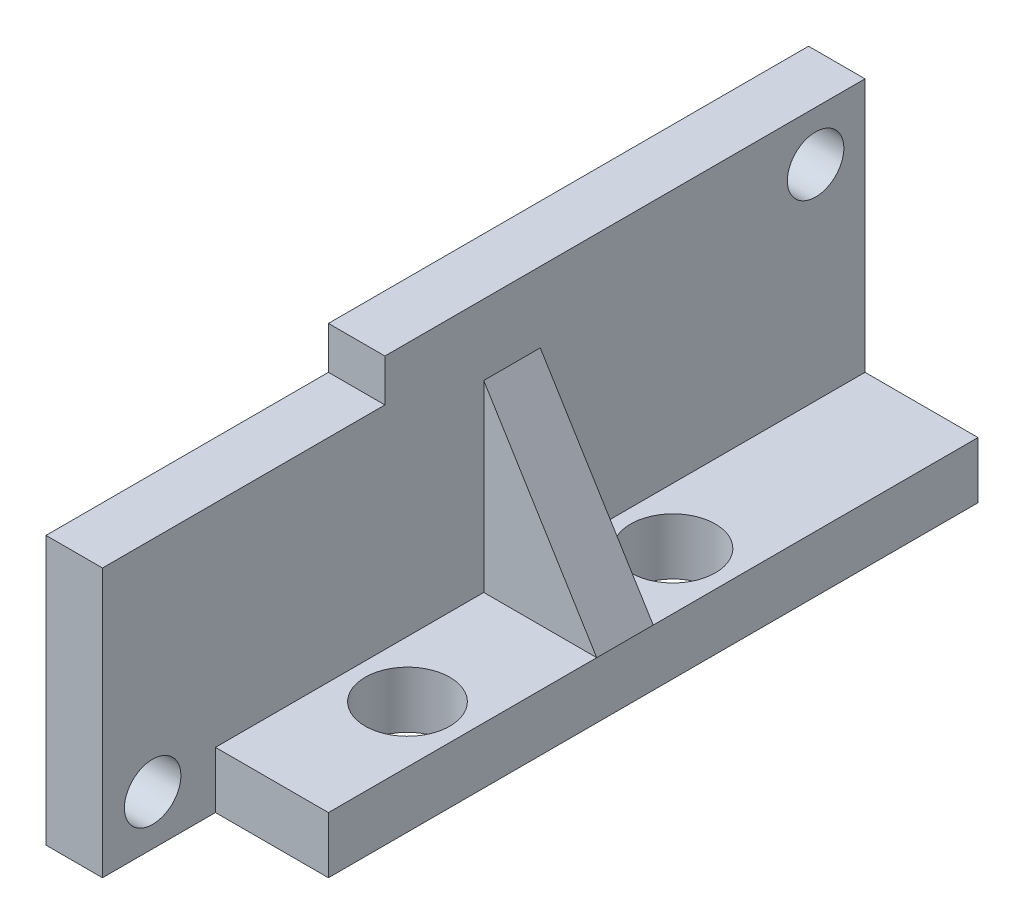
ISO-10303-21;
HEADER;
FILE_DESCRIPTION(('STEP AP214'),'2;1');
FILE_NAME('part.step','',(''),(''),'','','');
FILE_SCHEMA(('AUTOMOTIVE_DESIGN { 1 0 10303 214 1 1 1 1 }'));
ENDSEC;
DATA;
#1=APPLICATION_CONTEXT('core data for automotive mechanical design processes');
#2=APPLICATION_PROTOCOL_DEFINITION('international standard','automotive_design',2000,#1);
#3=PRODUCT_CONTEXT('',#1,'mechanical');
#4=PRODUCT('Part','Part','',(#3));
#5=PRODUCT_RELATED_PRODUCT_CATEGORY('part','',(#4));
#6=PRODUCT_DEFINITION_FORMATION('','',#4);
#7=PRODUCT_DEFINITION_CONTEXT('part definition',#1,'design');
#8=PRODUCT_DEFINITION('design','',#6,#7);
#9=PRODUCT_DEFINITION_SHAPE('','',#8);
#10=(LENGTH_UNIT() NAMED_UNIT(*) SI_UNIT(.MILLI.,.METRE.));
#11=(NAMED_UNIT(*) PLANE_ANGLE_UNIT() SI_UNIT($,.RADIAN.));
#12=(NAMED_UNIT(*) SI_UNIT($,.STERADIAN.) SOLID_ANGLE_UNIT());
#13=UNCERTAINTY_MEASURE_WITH_UNIT(LENGTH_MEASURE(1.E-05),#10,'distance_accuracy_value','');
#14=(GEOMETRIC_REPRESENTATION_CONTEXT(3) GLOBAL_UNCERTAINTY_ASSIGNED_CONTEXT((#13)) GLOBAL_UNIT_ASSIGNED_CONTEXT((#10,
#11,#12)) REPRESENTATION_CONTEXT('',''));
#15=CARTESIAN_POINT('',(0.,0.,0.));
#16=DIRECTION('',(0.,0.,1.));
#17=DIRECTION('',(1.,0.,0.));
#18=AXIS2_PLACEMENT_3D('',#15,#16,#17);
#19=CARTESIAN_POINT('',(6.,2.,13.5));
#20=DIRECTION('',(0.,-1.,0.));
#21=DIRECTION('',(1.,0.,0.));
#22=AXIS2_PLACEMENT_3D('',#19,#20,#21);
#23=PLANE('',#22);
#24=CARTESIAN_POINT('',(4.,2.,4.7));
#25=DIRECTION('',(0.,1.,0.));
#26=DIRECTION('',(-1.,0.,0.));
#27=AXIS2_PLACEMENT_3D('',#24,#25,#26);
#28=CIRCLE('',#27,1.5);
#29=CARTESIAN_POINT('',(2.5,2.,4.7));
#30=VERTEX_POINT('',#29);
#31=EDGE_CURVE('E253',#30,#30,#28,.T.);
#32=ORIENTED_EDGE('',*,*,#31,.F.);
#33=EDGE_LOOP('',(#32));
#34=FACE_BOUND('',#33,.T.);
#35=DIRECTION('',(0.,0.,-1.));
#36=VECTOR('',#35,1.);
#37=CARTESIAN_POINT('',(2.,2.,13.5));
#38=LINE('',#37,#36);
#39=CARTESIAN_POINT('',(2.,2.,9.5));
#40=VERTEX_POINT('',#39);
#41=CARTESIAN_POINT('',(2.,2.,0.));
#42=VERTEX_POINT('',#41);
#43=EDGE_CURVE('E145',#40,#42,#38,.T.);
#44=ORIENTED_EDGE('',*,*,#43,.F.);
#45=DIRECTION('',(-1.,0.,0.));
#46=VECTOR('',#45,1.);
#47=CARTESIAN_POINT('',(2.,2.,9.5));
#48=LINE('',#47,#46);
#49=CARTESIAN_POINT('',(6.,2.,9.5));
#50=VERTEX_POINT('',#49);
#51=EDGE_CURVE('E136',#50,#40,#48,.T.);
#52=ORIENTED_EDGE('',*,*,#51,.F.);
#53=DIRECTION('',(0.,0.,-1.));
#54=VECTOR('',#53,1.);
#55=CARTESIAN_POINT('',(6.,2.,13.5));
#56=LINE('',#55,#54);
#57=CARTESIAN_POINT('',(6.,2.,0.));
#58=VERTEX_POINT('',#57);
#59=EDGE_CURVE('E63',#50,#58,#56,.T.);
#60=ORIENTED_EDGE('',*,*,#59,.T.);
#61=DIRECTION('',(1.,0.,0.));
#62=VECTOR('',#61,1.);
#63=CARTESIAN_POINT('',(2.,2.,0.));
#64=LINE('',#63,#62);
#65=EDGE_CURVE('E267',#42,#58,#64,.T.);
#66=ORIENTED_EDGE('',*,*,#65,.F.);
#67=EDGE_LOOP('',(#44,#52,#60,#66));
#68=FACE_BOUND('',#67,.T.);
#69=ADVANCED_FACE('F38',(#34,#68),#23,.F.);
#70=CARTESIAN_POINT('',(0.,0.,-13.5));
#71=DIRECTION('',(0.,0.,1.));
#72=DIRECTION('',(1.,0.,0.));
#73=AXIS2_PLACEMENT_3D('',#70,#71,#72);
#74=PLANE('',#73);
#75=DIRECTION('',(0.,1.,0.));
#76=VECTOR('',#75,1.);
#77=CARTESIAN_POINT('',(2.,2.,-13.5));
#78=LINE('',#77,#76);
#79=CARTESIAN_POINT('',(2.,2.,-13.5));
#80=VERTEX_POINT('',#79);
#81=CARTESIAN_POINT('',(2.,11.,-13.5));
#82=VERTEX_POINT('',#81);
#83=EDGE_CURVE('E214',#80,#82,#78,.T.);
#84=ORIENTED_EDGE('',*,*,#83,.F.);
#85=DIRECTION('',(1.,0.,0.));
#86=VECTOR('',#85,1.);
#87=CARTESIAN_POINT('',(0.,2.,-13.5));
#88=LINE('',#87,#86);
#89=CARTESIAN_POINT('',(6.,2.,-13.5));
#90=VERTEX_POINT('',#89);
#91=EDGE_CURVE('E296',#80,#90,#88,.T.);
#92=ORIENTED_EDGE('',*,*,#91,.T.);
#93=DIRECTION('',(0.,1.,0.));
#94=VECTOR('',#93,1.);
#95=CARTESIAN_POINT('',(6.,-8.,-13.5));
#96=LINE('',#95,#94);
#97=CARTESIAN_POINT('',(6.,0.,-13.5));
#98=VERTEX_POINT('',#97);
#99=EDGE_CURVE('E292',#98,#90,#96,.T.);
#100=ORIENTED_EDGE('',*,*,#99,.F.);
#101=DIRECTION('',(1.,0.,0.));
#102=VECTOR('',#101,1.);
#103=CARTESIAN_POINT('',(0.,0.,-13.5));
#104=LINE('',#103,#102);
#105=CARTESIAN_POINT('',(0.,0.,-13.5));
#106=VERTEX_POINT('',#105);
#107=EDGE_CURVE('E280',#106,#98,#104,.T.);
#108=ORIENTED_EDGE('',*,*,#107,.F.);
#109=DIRECTION('',(0.,-1.,0.));
#110=VECTOR('',#109,1.);
#111=CARTESIAN_POINT('',(0.,11.,-13.5));
#112=LINE('',#111,#110);
#113=CARTESIAN_POINT('',(0.,11.,-13.5));
#114=VERTEX_POINT('',#113);
#115=EDGE_CURVE('E210',#114,#106,#112,.T.);
#116=ORIENTED_EDGE('',*,*,#115,.F.);
#117=DIRECTION('',(-1.,0.,0.));
#118=VECTOR('',#117,1.);
#119=CARTESIAN_POINT('',(2.,11.,-13.5));
#120=LINE('',#119,#118);
#121=EDGE_CURVE('E206',#82,#114,#120,.T.);
#122=ORIENTED_EDGE('',*,*,#121,.F.);
#123=EDGE_LOOP('',(#84,#92,#100,#108,#116,#122));
#124=FACE_BOUND('',#123,.T.);
#125=ADVANCED_FACE('F310',(#124),#74,.F.);
#126=CARTESIAN_POINT('',(2.,11.,13.5));
#127=DIRECTION('',(0.,-1.,0.));
#128=DIRECTION('',(0.,0.,-1.));
#129=AXIS2_PLACEMENT_3D('',#126,#127,#128);
#130=PLANE('',#129);
#131=DIRECTION('',(0.,0.,-1.));
#132=VECTOR('',#131,1.);
#133=CARTESIAN_POINT('',(0.,11.,13.5));
#134=LINE('',#133,#132);
#135=CARTESIAN_POINT('',(0.,11.,3.5));
#136=VERTEX_POINT('',#135);
#137=EDGE_CURVE('E166',#136,#114,#134,.T.);
#138=ORIENTED_EDGE('',*,*,#137,.F.);
#139=DIRECTION('',(1.,0.,0.));
#140=VECTOR('',#139,1.);
#141=CARTESIAN_POINT('',(-25.,11.,3.5));
#142=LINE('',#141,#140);
#143=CARTESIAN_POINT('',(2.,11.,3.5));
#144=VERTEX_POINT('',#143);
#145=EDGE_CURVE('E228',#136,#144,#142,.T.);
#146=ORIENTED_EDGE('',*,*,#145,.T.);
#147=DIRECTION('',(0.,0.,-1.));
#148=VECTOR('',#147,1.);
#149=CARTESIAN_POINT('',(2.,11.,13.5));
#150=LINE('',#149,#148);
#151=EDGE_CURVE('E197',#144,#82,#150,.T.);
#152=ORIENTED_EDGE('',*,*,#151,.T.);
#153=ORIENTED_EDGE('',*,*,#121,.T.);
#154=EDGE_LOOP('',(#138,#146,#152,#153));
#155=FACE_BOUND('',#154,.T.);
#156=ADVANCED_FACE('F40',(#155),#130,.F.);
#157=CARTESIAN_POINT('',(0.,11.,13.5));
#158=DIRECTION('',(1.,0.,0.));
#159=DIRECTION('',(0.,1.,0.));
#160=AXIS2_PLACEMENT_3D('',#157,#158,#159);
#161=PLANE('',#160);
#162=CARTESIAN_POINT('',(0.,9.24999999999999,-11.75));
#163=DIRECTION('',(-1.,0.,0.));
#164=DIRECTION('',(0.,-1.,0.));
#165=AXIS2_PLACEMENT_3D('',#162,#163,#164);
#166=CIRCLE('',#165,0.999999999999999);
#167=CARTESIAN_POINT('',(0.,8.24999999999999,-11.75));
#168=VERTEX_POINT('',#167);
#169=EDGE_CURVE('E241',#168,#168,#166,.T.);
#170=ORIENTED_EDGE('',*,*,#169,.F.);
#171=EDGE_LOOP('',(#170));
#172=FACE_BOUND('',#171,.T.);
#173=CARTESIAN_POINT('',(0.,1.75,11.7237776687708));
#174=DIRECTION('',(-1.,0.,0.));
#175=DIRECTION('',(0.,-1.,0.));
#176=AXIS2_PLACEMENT_3D('',#173,#174,#175);
#177=CIRCLE('',#176,1.);
#178=CARTESIAN_POINT('',(0.,0.749999999999998,11.7237776687708));
#179=VERTEX_POINT('',#178);
#180=EDGE_CURVE('E237',#179,#179,#177,.T.);
#181=ORIENTED_EDGE('',*,*,#180,.F.);
#182=EDGE_LOOP('',(#181));
#183=FACE_BOUND('',#182,.T.);
#184=ORIENTED_EDGE('',*,*,#115,.T.);
#185=DIRECTION('',(0.,0.,-1.));
#186=VECTOR('',#185,1.);
#187=CARTESIAN_POINT('',(0.,0.,13.5));
#188=LINE('',#187,#186);
#189=CARTESIAN_POINT('',(0.,0.,13.5));
#190=VERTEX_POINT('',#189);
#191=EDGE_CURVE('E158',#190,#106,#188,.T.);
#192=ORIENTED_EDGE('',*,*,#191,.F.);
#193=DIRECTION('',(0.,-1.,0.));
#194=VECTOR('',#193,1.);
#195=CARTESIAN_POINT('',(0.,11.,13.5));
#196=LINE('',#195,#194);
#197=CARTESIAN_POINT('',(0.,9.5,13.5));
#198=VERTEX_POINT('',#197);
#199=EDGE_CURVE('E202',#198,#190,#196,.T.);
#200=ORIENTED_EDGE('',*,*,#199,.F.);
#201=DIRECTION('',(0.,0.,-1.));
#202=VECTOR('',#201,1.);
#203=CARTESIAN_POINT('',(0.,9.5,13.5));
#204=LINE('',#203,#202);
#205=CARTESIAN_POINT('',(0.,9.5,3.5));
#206=VERTEX_POINT('',#205);
#207=EDGE_CURVE('E179',#198,#206,#204,.T.);
#208=ORIENTED_EDGE('',*,*,#207,.T.);
#209=DIRECTION('',(0.,1.,0.));
#210=VECTOR('',#209,1.);
#211=CARTESIAN_POINT('',(0.,11.,3.5));
#212=LINE('',#211,#210);
#213=EDGE_CURVE('E211',#206,#136,#212,.T.);
#214=ORIENTED_EDGE('',*,*,#213,.T.);
#215=ORIENTED_EDGE('',*,*,#137,.T.);
#216=EDGE_LOOP('',(#184,#192,#200,#208,#214,#215));
#217=FACE_BOUND('',#216,.T.);
#218=ADVANCED_FACE('F361',(#172,#183,#217),#161,.F.);
#219=CARTESIAN_POINT('',(0.,0.,13.5));
#220=DIRECTION('',(0.,1.,0.));
#221=DIRECTION('',(0.,0.,1.));
#222=AXIS2_PLACEMENT_3D('',#219,#220,#221);
#223=PLANE('',#222);
#224=CARTESIAN_POINT('',(4.,0.,4.7));
#225=DIRECTION('',(0.,1.,0.));
#226=DIRECTION('',(0.,0.,1.));
#227=AXIS2_PLACEMENT_3D('',#224,#225,#226);
#228=CIRCLE('',#227,1.5);
#229=CARTESIAN_POINT('',(4.,0.,6.2));
#230=VERTEX_POINT('',#229);
#231=EDGE_CURVE('E242',#230,#230,#228,.T.);
#232=ORIENTED_EDGE('',*,*,#231,.T.);
#233=EDGE_LOOP('',(#232));
#234=FACE_BOUND('',#233,.T.);
#235=CARTESIAN_POINT('',(4.,0.,-4.7));
#236=DIRECTION('',(0.,1.,0.));
#237=DIRECTION('',(0.,0.,1.));
#238=AXIS2_PLACEMENT_3D('',#235,#236,#237);
#239=CIRCLE('',#238,1.5);
#240=CARTESIAN_POINT('',(4.,0.,-3.2));
#241=VERTEX_POINT('',#240);
#242=EDGE_CURVE('E249',#241,#241,#239,.T.);
#243=ORIENTED_EDGE('',*,*,#242,.T.);
#244=EDGE_LOOP('',(#243));
#245=FACE_BOUND('',#244,.T.);
#246=DIRECTION('',(-1.,0.,0.));
#247=VECTOR('',#246,1.);
#248=CARTESIAN_POINT('',(0.,0.,9.5));
#249=LINE('',#248,#247);
#250=CARTESIAN_POINT('',(6.,0.,9.5));
#251=VERTEX_POINT('',#250);
#252=CARTESIAN_POINT('',(2.,0.,9.5));
#253=VERTEX_POINT('',#252);
#254=EDGE_CURVE('E139',#251,#253,#249,.T.);
#255=ORIENTED_EDGE('',*,*,#254,.T.);
#256=DIRECTION('',(0.,0.,1.));
#257=VECTOR('',#256,1.);
#258=CARTESIAN_POINT('',(2.,0.,13.5));
#259=LINE('',#258,#257);
#260=CARTESIAN_POINT('',(2.,0.,13.5));
#261=VERTEX_POINT('',#260);
#262=EDGE_CURVE('E301',#253,#261,#259,.T.);
#263=ORIENTED_EDGE('',*,*,#262,.T.);
#264=DIRECTION('',(1.,0.,0.));
#265=VECTOR('',#264,1.);
#266=CARTESIAN_POINT('',(0.,0.,13.5));
#267=LINE('',#266,#265);
#268=EDGE_CURVE('E195',#190,#261,#267,.T.);
#269=ORIENTED_EDGE('',*,*,#268,.F.);
#270=ORIENTED_EDGE('',*,*,#191,.T.);
#271=ORIENTED_EDGE('',*,*,#107,.T.);
#272=DIRECTION('',(0.,0.,-1.));
#273=VECTOR('',#272,1.);
#274=CARTESIAN_POINT('',(6.,0.,13.5));
#275=LINE('',#274,#273);
#276=EDGE_CURVE('E153',#251,#98,#275,.T.);
#277=ORIENTED_EDGE('',*,*,#276,.F.);
#278=EDGE_LOOP('',(#255,#263,#269,#270,#271,#277));
#279=FACE_BOUND('',#278,.T.);
#280=ADVANCED_FACE('F306',(#234,#245,#279),#223,.F.);
#281=CARTESIAN_POINT('',(6.,0.,13.5));
#282=DIRECTION('',(-1.,0.,0.));
#283=DIRECTION('',(0.,0.,1.));
#284=AXIS2_PLACEMENT_3D('',#281,#282,#283);
#285=PLANE('',#284);
#286=ORIENTED_EDGE('',*,*,#59,.F.);
#287=DIRECTION('',(0.,1.,0.));
#288=VECTOR('',#287,1.);
#289=CARTESIAN_POINT('',(6.,-8.,9.5));
#290=LINE('',#289,#288);
#291=EDGE_CURVE('E133',#251,#50,#290,.T.);
#292=ORIENTED_EDGE('',*,*,#291,.F.);
#293=ORIENTED_EDGE('',*,*,#276,.T.);
#294=ORIENTED_EDGE('',*,*,#99,.T.);
#295=CARTESIAN_POINT('',(6.,2.,-2.));
#296=VERTEX_POINT('',#295);
#297=EDGE_CURVE('E154',#296,#90,#56,.T.);
#298=ORIENTED_EDGE('',*,*,#297,.F.);
#299=DIRECTION('',(0.,0.,1.));
#300=VECTOR('',#299,1.);
#301=CARTESIAN_POINT('',(6.,2.,-2.));
#302=LINE('',#301,#300);
#303=EDGE_CURVE('E150',#296,#58,#302,.T.);
#304=ORIENTED_EDGE('',*,*,#303,.T.);
#305=EDGE_LOOP('',(#286,#292,#293,#294,#298,#304));
#306=FACE_BOUND('',#305,.T.);
#307=ADVANCED_FACE('F148',(#306),#285,.F.);
#308=CARTESIAN_POINT('',(4.,2.,-4.7));
#309=DIRECTION('',(0.,1.,0.));
#310=DIRECTION('',(1.,0.,0.));
#311=AXIS2_PLACEMENT_3D('',#308,#309,#310);
#312=CIRCLE('',#311,1.5);
#313=CARTESIAN_POINT('',(5.5,2.,-4.7));
#314=VERTEX_POINT('',#313);
#315=EDGE_CURVE('E254',#314,#314,#312,.T.);
#316=ORIENTED_EDGE('',*,*,#315,.F.);
#317=EDGE_LOOP('',(#316));
#318=FACE_BOUND('',#317,.T.);
#319=ORIENTED_EDGE('',*,*,#297,.T.);
#320=ORIENTED_EDGE('',*,*,#91,.F.);
#321=CARTESIAN_POINT('',(2.,2.,-2.));
#322=VERTEX_POINT('',#321);
#323=EDGE_CURVE('E201',#322,#80,#38,.T.);
#324=ORIENTED_EDGE('',*,*,#323,.F.);
#325=DIRECTION('',(1.,0.,0.));
#326=VECTOR('',#325,1.);
#327=CARTESIAN_POINT('',(2.,2.,-2.));
#328=LINE('',#327,#326);
#329=EDGE_CURVE('E55',#322,#296,#328,.T.);
#330=ORIENTED_EDGE('',*,*,#329,.T.);
#331=EDGE_LOOP('',(#319,#320,#324,#330));
#332=FACE_BOUND('',#331,.T.);
#333=ADVANCED_FACE('F312',(#318,#332),#23,.F.);
#334=CARTESIAN_POINT('',(2.,2.,13.5));
#335=DIRECTION('',(-1.,0.,0.));
#336=DIRECTION('',(0.,0.,1.));
#337=AXIS2_PLACEMENT_3D('',#334,#335,#336);
#338=PLANE('',#337);
#339=DIRECTION('',(0.,1.,0.));
#340=VECTOR('',#339,1.);
#341=CARTESIAN_POINT('',(2.,-8.,9.5));
#342=LINE('',#341,#340);
#343=EDGE_CURVE('E143',#253,#40,#342,.T.);
#344=ORIENTED_EDGE('',*,*,#343,.T.);
#345=ORIENTED_EDGE('',*,*,#43,.T.);
#346=DIRECTION('',(0.,-1.,0.));
#347=VECTOR('',#346,1.);
#348=CARTESIAN_POINT('',(2.,8.5,0.));
#349=LINE('',#348,#347);
#350=CARTESIAN_POINT('',(2.,8.5,0.));
#351=VERTEX_POINT('',#350);
#352=EDGE_CURVE('E272',#351,#42,#349,.T.);
#353=ORIENTED_EDGE('',*,*,#352,.F.);
#354=DIRECTION('',(0.,0.,1.));
#355=VECTOR('',#354,1.);
#356=CARTESIAN_POINT('',(2.,8.5,-2.));
#357=LINE('',#356,#355);
#358=CARTESIAN_POINT('',(2.,8.5,-2.));
#359=VERTEX_POINT('',#358);
#360=EDGE_CURVE('E261',#359,#351,#357,.T.);
#361=ORIENTED_EDGE('',*,*,#360,.F.);
#362=DIRECTION('',(0.,-1.,0.));
#363=VECTOR('',#362,1.);
#364=CARTESIAN_POINT('',(2.,8.5,-2.));
#365=LINE('',#364,#363);
#366=EDGE_CURVE('E283',#359,#322,#365,.T.);
#367=ORIENTED_EDGE('',*,*,#366,.T.);
#368=ORIENTED_EDGE('',*,*,#323,.T.);
#369=ORIENTED_EDGE('',*,*,#83,.T.);
#370=ORIENTED_EDGE('',*,*,#151,.F.);
#371=DIRECTION('',(0.,1.,0.));
#372=VECTOR('',#371,1.);
#373=CARTESIAN_POINT('',(2.,9.5,3.5));
#374=LINE('',#373,#372);
#375=CARTESIAN_POINT('',(2.,9.5,3.5));
#376=VERTEX_POINT('',#375);
#377=EDGE_CURVE('E189',#376,#144,#374,.T.);
#378=ORIENTED_EDGE('',*,*,#377,.F.);
#379=DIRECTION('',(0.,0.,-1.));
#380=VECTOR('',#379,1.);
#381=CARTESIAN_POINT('',(2.,9.5,13.5));
#382=LINE('',#381,#380);
#383=CARTESIAN_POINT('',(2.,9.5,13.5));
#384=VERTEX_POINT('',#383);
#385=EDGE_CURVE('E176',#384,#376,#382,.T.);
#386=ORIENTED_EDGE('',*,*,#385,.F.);
#387=DIRECTION('',(0.,1.,0.));
#388=VECTOR('',#387,1.);
#389=CARTESIAN_POINT('',(2.,2.,13.5));
#390=LINE('',#389,#388);
#391=EDGE_CURVE('E186',#261,#384,#390,.T.);
#392=ORIENTED_EDGE('',*,*,#391,.F.);
#393=ORIENTED_EDGE('',*,*,#262,.F.);
#394=EDGE_LOOP('',(#344,#345,#353,#361,#367,#368,#369,#370,#378,#386,#392,#393));
#395=FACE_BOUND('',#394,.T.);
#396=CARTESIAN_POINT('',(2.,9.24999999999999,-11.75));
#397=DIRECTION('',(-1.,0.,0.));
#398=DIRECTION('',(0.,0.,1.));
#399=AXIS2_PLACEMENT_3D('',#396,#397,#398);
#400=CIRCLE('',#399,0.999999999999999);
#401=CARTESIAN_POINT('',(2.,9.24999999999999,-10.75));
#402=VERTEX_POINT('',#401);
#403=EDGE_CURVE('E42',#402,#402,#400,.T.);
#404=ORIENTED_EDGE('',*,*,#403,.T.);
#405=EDGE_LOOP('',(#404));
#406=FACE_BOUND('',#405,.T.);
#407=CARTESIAN_POINT('',(2.,1.75,11.7237776687708));
#408=DIRECTION('',(-1.,0.,0.));
#409=DIRECTION('',(0.,0.,1.));
#410=AXIS2_PLACEMENT_3D('',#407,#408,#409);
#411=CIRCLE('',#410,1.);
#412=CARTESIAN_POINT('',(2.,1.75,12.7237776687708));
#413=VERTEX_POINT('',#412);
#414=EDGE_CURVE('E11',#413,#413,#411,.T.);
#415=ORIENTED_EDGE('',*,*,#414,.T.);
#416=EDGE_LOOP('',(#415));
#417=FACE_BOUND('',#416,.T.);
#418=ADVANCED_FACE('F184',(#395,#406,#417),#338,.F.);
#419=CARTESIAN_POINT('',(0.,0.,13.5));
#420=DIRECTION('',(0.,0.,1.));
#421=DIRECTION('',(1.,0.,0.));
#422=AXIS2_PLACEMENT_3D('',#419,#420,#421);
#423=PLANE('',#422);
#424=ORIENTED_EDGE('',*,*,#268,.T.);
#425=ORIENTED_EDGE('',*,*,#391,.T.);
#426=DIRECTION('',(1.,0.,0.));
#427=VECTOR('',#426,1.);
#428=CARTESIAN_POINT('',(0.,9.5,13.5));
#429=LINE('',#428,#427);
#430=EDGE_CURVE('E48',#198,#384,#429,.T.);
#431=ORIENTED_EDGE('',*,*,#430,.F.);
#432=ORIENTED_EDGE('',*,*,#199,.T.);
#433=EDGE_LOOP('',(#424,#425,#431,#432));
#434=FACE_BOUND('',#433,.T.);
#435=ADVANCED_FACE('F193',(#434),#423,.T.);
#436=CARTESIAN_POINT('',(-25.,9.5,3.5));
#437=DIRECTION('',(0.,0.,-1.));
#438=DIRECTION('',(-1.,0.,0.));
#439=AXIS2_PLACEMENT_3D('',#436,#437,#438);
#440=PLANE('',#439);
#441=DIRECTION('',(1.,0.,0.));
#442=VECTOR('',#441,1.);
#443=CARTESIAN_POINT('',(-25.,9.5,3.5));
#444=LINE('',#443,#442);
#445=EDGE_CURVE('E229',#206,#376,#444,.T.);
#446=ORIENTED_EDGE('',*,*,#445,.T.);
#447=ORIENTED_EDGE('',*,*,#377,.T.);
#448=ORIENTED_EDGE('',*,*,#145,.F.);
#449=ORIENTED_EDGE('',*,*,#213,.F.);
#450=EDGE_LOOP('',(#446,#447,#448,#449));
#451=FACE_BOUND('',#450,.T.);
#452=ADVANCED_FACE('F384',(#451),#440,.F.);
#453=CARTESIAN_POINT('',(-25.,9.5,13.5));
#454=DIRECTION('',(0.,-1.,0.));
#455=DIRECTION('',(1.,0.,0.));
#456=AXIS2_PLACEMENT_3D('',#453,#454,#455);
#457=PLANE('',#456);
#458=ORIENTED_EDGE('',*,*,#430,.T.);
#459=ORIENTED_EDGE('',*,*,#385,.T.);
#460=ORIENTED_EDGE('',*,*,#445,.F.);
#461=ORIENTED_EDGE('',*,*,#207,.F.);
#462=EDGE_LOOP('',(#458,#459,#460,#461));
#463=FACE_BOUND('',#462,.T.);
#464=ADVANCED_FACE('F174',(#463),#457,.F.);
#465=CARTESIAN_POINT('',(3.6,1.75,11.7237776687708));
#466=DIRECTION('',(-1.,0.,0.));
#467=DIRECTION('',(0.,-1.,0.));
#468=AXIS2_PLACEMENT_3D('',#465,#466,#467);
#469=CYLINDRICAL_SURFACE('',#468,1.);
#470=ORIENTED_EDGE('',*,*,#180,.T.);
#471=EDGE_LOOP('',(#470));
#472=FACE_BOUND('',#471,.T.);
#473=ORIENTED_EDGE('',*,*,#414,.F.);
#474=EDGE_LOOP('',(#473));
#475=FACE_BOUND('',#474,.T.);
#476=ADVANCED_FACE('F379',(#472,#475),#469,.F.);
#477=CARTESIAN_POINT('',(3.6,9.24999999999999,-11.75));
#478=DIRECTION('',(-1.,0.,0.));
#479=DIRECTION('',(0.,-1.,0.));
#480=AXIS2_PLACEMENT_3D('',#477,#478,#479);
#481=CYLINDRICAL_SURFACE('',#480,0.999999999999999);
#482=ORIENTED_EDGE('',*,*,#169,.T.);
#483=EDGE_LOOP('',(#482));
#484=FACE_BOUND('',#483,.T.);
#485=ORIENTED_EDGE('',*,*,#403,.F.);
#486=EDGE_LOOP('',(#485));
#487=FACE_BOUND('',#486,.T.);
#488=ADVANCED_FACE('F357',(#484,#487),#481,.F.);
#489=CARTESIAN_POINT('',(4.,-7.,-4.7));
#490=DIRECTION('',(0.,1.,0.));
#491=DIRECTION('',(-1.,0.,0.));
#492=AXIS2_PLACEMENT_3D('',#489,#490,#491);
#493=CYLINDRICAL_SURFACE('',#492,1.5);
#494=ORIENTED_EDGE('',*,*,#315,.T.);
#495=EDGE_LOOP('',(#494));
#496=FACE_BOUND('',#495,.T.);
#497=ORIENTED_EDGE('',*,*,#242,.F.);
#498=EDGE_LOOP('',(#497));
#499=FACE_BOUND('',#498,.T.);
#500=ADVANCED_FACE('F353',(#496,#499),#493,.F.);
#501=CARTESIAN_POINT('',(4.,-7.,4.7));
#502=DIRECTION('',(0.,1.,0.));
#503=DIRECTION('',(-1.,0.,0.));
#504=AXIS2_PLACEMENT_3D('',#501,#502,#503);
#505=CYLINDRICAL_SURFACE('',#504,1.5);
#506=ORIENTED_EDGE('',*,*,#31,.T.);
#507=EDGE_LOOP('',(#506));
#508=FACE_BOUND('',#507,.T.);
#509=ORIENTED_EDGE('',*,*,#231,.F.);
#510=EDGE_LOOP('',(#509));
#511=FACE_BOUND('',#510,.T.);
#512=ADVANCED_FACE('F356',(#508,#511),#505,.F.);
#513=CARTESIAN_POINT('',(6.,2.,-2.));
#514=DIRECTION('',(0.851658316704544,0.524097425664335,0.));
#515=DIRECTION('',(-0.524097425664335,0.851658316704544,0.));
#516=AXIS2_PLACEMENT_3D('',#513,#514,#515);
#517=PLANE('',#516);
#518=DIRECTION('',(-0.524097425664335,0.851658316704544,0.));
#519=VECTOR('',#518,1.);
#520=CARTESIAN_POINT('',(6.,2.,0.));
#521=LINE('',#520,#519);
#522=EDGE_CURVE('E276',#58,#351,#521,.T.);
#523=ORIENTED_EDGE('',*,*,#522,.F.);
#524=ORIENTED_EDGE('',*,*,#303,.F.);
#525=DIRECTION('',(-0.524097425664335,0.851658316704544,0.));
#526=VECTOR('',#525,1.);
#527=CARTESIAN_POINT('',(6.,2.,-2.));
#528=LINE('',#527,#526);
#529=EDGE_CURVE('E271',#296,#359,#528,.T.);
#530=ORIENTED_EDGE('',*,*,#529,.T.);
#531=ORIENTED_EDGE('',*,*,#360,.T.);
#532=EDGE_LOOP('',(#523,#524,#530,#531));
#533=FACE_BOUND('',#532,.T.);
#534=ADVANCED_FACE('F320',(#533),#517,.T.);
#535=CARTESIAN_POINT('',(0.,0.,-2.));
#536=DIRECTION('',(0.,0.,-1.));
#537=DIRECTION('',(-1.,0.,0.));
#538=AXIS2_PLACEMENT_3D('',#535,#536,#537);
#539=PLANE('',#538);
#540=ORIENTED_EDGE('',*,*,#529,.F.);
#541=ORIENTED_EDGE('',*,*,#329,.F.);
#542=ORIENTED_EDGE('',*,*,#366,.F.);
#543=EDGE_LOOP('',(#540,#541,#542));
#544=FACE_BOUND('',#543,.T.);
#545=ADVANCED_FACE('F318',(#544),#539,.T.);
#546=CARTESIAN_POINT('',(0.,0.,0.));
#547=DIRECTION('',(0.,0.,-1.));
#548=DIRECTION('',(-1.,0.,0.));
#549=AXIS2_PLACEMENT_3D('',#546,#547,#548);
#550=PLANE('',#549);
#551=ORIENTED_EDGE('',*,*,#522,.T.);
#552=ORIENTED_EDGE('',*,*,#352,.T.);
#553=ORIENTED_EDGE('',*,*,#65,.T.);
#554=EDGE_LOOP('',(#551,#552,#553));
#555=FACE_BOUND('',#554,.T.);
#556=ADVANCED_FACE('F322',(#555),#550,.F.);
#557=CARTESIAN_POINT('',(2.,-8.,9.5));
#558=DIRECTION('',(0.,0.,-1.));
#559=DIRECTION('',(-1.,0.,0.));
#560=AXIS2_PLACEMENT_3D('',#557,#558,#559);
#561=PLANE('',#560);
#562=ORIENTED_EDGE('',*,*,#291,.T.);
#563=ORIENTED_EDGE('',*,*,#51,.T.);
#564=ORIENTED_EDGE('',*,*,#343,.F.);
#565=ORIENTED_EDGE('',*,*,#254,.F.);
#566=EDGE_LOOP('',(#562,#563,#564,#565));
#567=FACE_BOUND('',#566,.T.);
#568=ADVANCED_FACE('F134',(#567),#561,.F.);
#569=CLOSED_SHELL('',(#69,#125,#156,#218,#280,#307,#333,#418,#435,#452,#464,#476,#488,#500,#512,
#534,#545,#556,#568));
#570=MANIFOLD_SOLID_BREP('B2',#569);
#571=ADVANCED_BREP_SHAPE_REPRESENTATION('',(#18,#570),#14);
#572=SHAPE_DEFINITION_REPRESENTATION(#9,#571);
ENDSEC;
END-ISO-10303-21;
